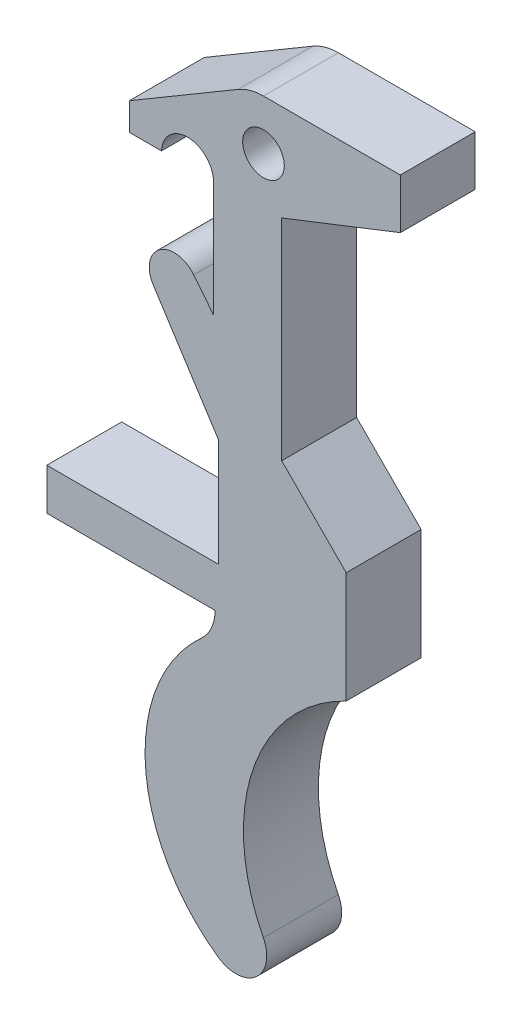
ISO-10303-21;
HEADER;
FILE_DESCRIPTION(('STEP AP214'),'2;1');
FILE_NAME('part.step','',(''),(''),'','','');
FILE_SCHEMA(('AUTOMOTIVE_DESIGN { 1 0 10303 214 1 1 1 1 }'));
ENDSEC;
DATA;
#1=APPLICATION_CONTEXT('core data for automotive mechanical design processes');
#2=APPLICATION_PROTOCOL_DEFINITION('international standard','automotive_design',2000,#1);
#3=PRODUCT_CONTEXT('',#1,'mechanical');
#4=PRODUCT('Part','Part','',(#3));
#5=PRODUCT_RELATED_PRODUCT_CATEGORY('part','',(#4));
#6=PRODUCT_DEFINITION_FORMATION('','',#4);
#7=PRODUCT_DEFINITION_CONTEXT('part definition',#1,'design');
#8=PRODUCT_DEFINITION('design','',#6,#7);
#9=PRODUCT_DEFINITION_SHAPE('','',#8);
#10=(LENGTH_UNIT() NAMED_UNIT(*) SI_UNIT(.MILLI.,.METRE.));
#11=(NAMED_UNIT(*) PLANE_ANGLE_UNIT() SI_UNIT($,.RADIAN.));
#12=(NAMED_UNIT(*) SI_UNIT($,.STERADIAN.) SOLID_ANGLE_UNIT());
#13=UNCERTAINTY_MEASURE_WITH_UNIT(LENGTH_MEASURE(1.E-05),#10,'distance_accuracy_value','');
#14=(GEOMETRIC_REPRESENTATION_CONTEXT(3) GLOBAL_UNCERTAINTY_ASSIGNED_CONTEXT((#13)) GLOBAL_UNIT_ASSIGNED_CONTEXT((#10,
#11,#12)) REPRESENTATION_CONTEXT('',''));
#15=CARTESIAN_POINT('',(0.,0.,0.));
#16=DIRECTION('',(0.,0.,1.));
#17=DIRECTION('',(1.,0.,0.));
#18=AXIS2_PLACEMENT_3D('',#15,#16,#17);
#19=CARTESIAN_POINT('',(2.19049760436048,0.,9.));
#20=DIRECTION('',(1.,0.,0.));
#21=DIRECTION('',(0.,1.,0.));
#22=AXIS2_PLACEMENT_3D('',#19,#20,#21);
#23=PLANE('',#22);
#24=DIRECTION('',(0.,-1.,0.));
#25=VECTOR('',#24,1.);
#26=CARTESIAN_POINT('',(2.19049760436048,0.,0.));
#27=LINE('',#26,#25);
#28=CARTESIAN_POINT('',(2.19049760436048,-5.58585000204006,0.));
#29=VERTEX_POINT('',#28);
#30=CARTESIAN_POINT('',(2.19049760436049,-30.8472529263684,0.));
#31=VERTEX_POINT('',#30);
#32=EDGE_CURVE('E221',#29,#31,#27,.T.);
#33=ORIENTED_EDGE('',*,*,#32,.F.);
#34=DIRECTION('',(0.,0.,-1.));
#35=VECTOR('',#34,1.);
#36=CARTESIAN_POINT('',(2.19049760436048,-5.58585000204006,9.));
#37=LINE('',#36,#35);
#38=CARTESIAN_POINT('',(2.19049760436048,-5.58585000204006,9.));
#39=VERTEX_POINT('',#38);
#40=EDGE_CURVE('E11',#39,#29,#37,.T.);
#41=ORIENTED_EDGE('',*,*,#40,.F.);
#42=DIRECTION('',(0.,-1.,0.));
#43=VECTOR('',#42,1.);
#44=CARTESIAN_POINT('',(2.19049760436048,0.,9.));
#45=LINE('',#44,#43);
#46=CARTESIAN_POINT('',(2.19049760436049,-30.8472529263684,9.));
#47=VERTEX_POINT('',#46);
#48=EDGE_CURVE('E284',#39,#47,#45,.T.);
#49=ORIENTED_EDGE('',*,*,#48,.T.);
#50=DIRECTION('',(0.,0.,-1.));
#51=VECTOR('',#50,1.);
#52=CARTESIAN_POINT('',(2.19049760436049,-30.8472529263684,9.));
#53=LINE('',#52,#51);
#54=EDGE_CURVE('E51',#47,#31,#53,.T.);
#55=ORIENTED_EDGE('',*,*,#54,.T.);
#56=EDGE_LOOP('',(#33,#41,#49,#55));
#57=FACE_BOUND('',#56,.T.);
#58=ADVANCED_FACE('F35',(#57),#23,.T.);
#59=CARTESIAN_POINT('',(2.19049760436048,-5.58585000204006,9.));
#60=DIRECTION('',(0.36508293406008,-0.930975000340011,0.));
#61=DIRECTION('',(0.930975000340011,0.36508293406008,0.));
#62=AXIS2_PLACEMENT_3D('',#59,#60,#61);
#63=PLANE('',#62);
#64=DIRECTION('',(-0.930975000340011,-0.365082934060081,0.));
#65=VECTOR('',#64,1.);
#66=CARTESIAN_POINT('',(2.19049760436048,-5.58585000204006,0.));
#67=LINE('',#66,#65);
#68=CARTESIAN_POINT('',(16.4346219454142,0.,0.));
#69=VERTEX_POINT('',#68);
#70=EDGE_CURVE('E223',#69,#29,#67,.T.);
#71=ORIENTED_EDGE('',*,*,#70,.F.);
#72=DIRECTION('',(0.,0.,-1.));
#73=VECTOR('',#72,1.);
#74=CARTESIAN_POINT('',(16.4346219454142,0.,9.));
#75=LINE('',#74,#73);
#76=CARTESIAN_POINT('',(16.4346219454142,0.,9.));
#77=VERTEX_POINT('',#76);
#78=EDGE_CURVE('E43',#77,#69,#75,.T.);
#79=ORIENTED_EDGE('',*,*,#78,.F.);
#80=DIRECTION('',(-0.930975000340011,-0.365082934060081,0.));
#81=VECTOR('',#80,1.);
#82=CARTESIAN_POINT('',(2.19049760436048,-5.58585000204006,9.));
#83=LINE('',#82,#81);
#84=EDGE_CURVE('E348',#77,#39,#83,.T.);
#85=ORIENTED_EDGE('',*,*,#84,.T.);
#86=ORIENTED_EDGE('',*,*,#40,.T.);
#87=EDGE_LOOP('',(#71,#79,#85,#86));
#88=FACE_BOUND('',#87,.T.);
#89=ADVANCED_FACE('F336',(#88),#63,.T.);
#90=CARTESIAN_POINT('',(16.4346219454142,0.,9.));
#91=DIRECTION('',(1.,0.,0.));
#92=DIRECTION('',(0.,0.,-1.));
#93=AXIS2_PLACEMENT_3D('',#90,#91,#92);
#94=PLANE('',#93);
#95=DIRECTION('',(0.,-1.,0.));
#96=VECTOR('',#95,1.);
#97=CARTESIAN_POINT('',(16.4346219454142,0.,0.));
#98=LINE('',#97,#96);
#99=CARTESIAN_POINT('',(16.4346219454142,6.,0.));
#100=VERTEX_POINT('',#99);
#101=EDGE_CURVE('E226',#100,#69,#98,.T.);
#102=ORIENTED_EDGE('',*,*,#101,.F.);
#103=DIRECTION('',(0.,0.,-1.));
#104=VECTOR('',#103,1.);
#105=CARTESIAN_POINT('',(16.4346219454142,6.,9.));
#106=LINE('',#105,#104);
#107=CARTESIAN_POINT('',(16.4346219454142,6.,9.));
#108=VERTEX_POINT('',#107);
#109=EDGE_CURVE('E325',#108,#100,#106,.T.);
#110=ORIENTED_EDGE('',*,*,#109,.F.);
#111=DIRECTION('',(0.,-1.,0.));
#112=VECTOR('',#111,1.);
#113=CARTESIAN_POINT('',(16.4346219454142,0.,9.));
#114=LINE('',#113,#112);
#115=EDGE_CURVE('E332',#108,#77,#114,.T.);
#116=ORIENTED_EDGE('',*,*,#115,.T.);
#117=ORIENTED_EDGE('',*,*,#78,.T.);
#118=EDGE_LOOP('',(#102,#110,#116,#117));
#119=FACE_BOUND('',#118,.T.);
#120=ADVANCED_FACE('F330',(#119),#94,.T.);
#121=CARTESIAN_POINT('',(0.,6.,9.));
#122=DIRECTION('',(0.,1.,0.));
#123=DIRECTION('',(0.,0.,1.));
#124=AXIS2_PLACEMENT_3D('',#121,#122,#123);
#125=PLANE('',#124);
#126=DIRECTION('',(1.,0.,0.));
#127=VECTOR('',#126,1.);
#128=CARTESIAN_POINT('',(0.,6.,0.));
#129=LINE('',#128,#127);
#130=CARTESIAN_POINT('',(0.,6.,0.));
#131=VERTEX_POINT('',#130);
#132=EDGE_CURVE('E229',#131,#100,#129,.T.);
#133=ORIENTED_EDGE('',*,*,#132,.F.);
#134=DIRECTION('',(0.,0.,-1.));
#135=VECTOR('',#134,1.);
#136=CARTESIAN_POINT('',(0.,6.,9.));
#137=LINE('',#136,#135);
#138=CARTESIAN_POINT('',(0.,6.,9.));
#139=VERTEX_POINT('',#138);
#140=EDGE_CURVE('E323',#139,#131,#137,.T.);
#141=ORIENTED_EDGE('',*,*,#140,.F.);
#142=DIRECTION('',(1.,0.,0.));
#143=VECTOR('',#142,1.);
#144=CARTESIAN_POINT('',(0.,6.,9.));
#145=LINE('',#144,#143);
#146=EDGE_CURVE('E347',#139,#108,#145,.T.);
#147=ORIENTED_EDGE('',*,*,#146,.T.);
#148=ORIENTED_EDGE('',*,*,#109,.T.);
#149=EDGE_LOOP('',(#133,#141,#147,#148));
#150=FACE_BOUND('',#149,.T.);
#151=ADVANCED_FACE('F343',(#150),#125,.T.);
#152=CARTESIAN_POINT('',(0.,0.,9.));
#153=DIRECTION('',(0.,0.,-1.));
#154=DIRECTION('',(-1.,0.,0.));
#155=AXIS2_PLACEMENT_3D('',#152,#153,#154);
#156=CYLINDRICAL_SURFACE('',#155,6.);
#157=CARTESIAN_POINT('',(0.,0.,0.));
#158=DIRECTION('',(0.,0.,1.));
#159=DIRECTION('',(1.,0.,0.));
#160=AXIS2_PLACEMENT_3D('',#157,#158,#159);
#161=CIRCLE('',#160,6.);
#162=CARTESIAN_POINT('',(-3.04957065323369,5.16721577166426,0.));
#163=VERTEX_POINT('',#162);
#164=EDGE_CURVE('E232',#131,#163,#161,.T.);
#165=ORIENTED_EDGE('',*,*,#164,.T.);
#166=DIRECTION('',(0.,0.,-1.));
#167=VECTOR('',#166,1.);
#168=CARTESIAN_POINT('',(-3.04957065323369,5.16721577166426,9.));
#169=LINE('',#168,#167);
#170=CARTESIAN_POINT('',(-3.04957065323369,5.16721577166426,9.));
#171=VERTEX_POINT('',#170);
#172=EDGE_CURVE('E321',#171,#163,#169,.T.);
#173=ORIENTED_EDGE('',*,*,#172,.F.);
#174=CARTESIAN_POINT('',(0.,0.,9.));
#175=DIRECTION('',(0.,0.,1.));
#176=DIRECTION('',(1.,0.,0.));
#177=AXIS2_PLACEMENT_3D('',#174,#175,#176);
#178=CIRCLE('',#177,6.);
#179=EDGE_CURVE('E350',#139,#171,#178,.T.);
#180=ORIENTED_EDGE('',*,*,#179,.F.);
#181=ORIENTED_EDGE('',*,*,#140,.T.);
#182=EDGE_LOOP('',(#165,#173,#180,#181));
#183=FACE_BOUND('',#182,.T.);
#184=ADVANCED_FACE('F423',(#183),#156,.T.);
#185=CARTESIAN_POINT('',(-3.04957065323369,5.16721577166426,9.));
#186=DIRECTION('',(-0.508261775538949,0.861202628610709,0.));
#187=DIRECTION('',(-0.861202628610709,-0.508261775538949,0.));
#188=AXIS2_PLACEMENT_3D('',#185,#186,#187);
#189=PLANE('',#188);
#190=DIRECTION('',(0.861202628610709,0.508261775538949,0.));
#191=VECTOR('',#190,1.);
#192=CARTESIAN_POINT('',(-3.04957065323369,5.16721577166426,0.));
#193=LINE('',#192,#191);
#194=CARTESIAN_POINT('',(-16.1110905908968,-2.54138972279823,0.));
#195=VERTEX_POINT('',#194);
#196=EDGE_CURVE('E235',#195,#163,#193,.T.);
#197=ORIENTED_EDGE('',*,*,#196,.F.);
#198=DIRECTION('',(0.,0.,-1.));
#199=VECTOR('',#198,1.);
#200=CARTESIAN_POINT('',(-16.1110905908968,-2.54138972279823,9.));
#201=LINE('',#200,#199);
#202=CARTESIAN_POINT('',(-16.1110905908968,-2.54138972279823,9.));
#203=VERTEX_POINT('',#202);
#204=EDGE_CURVE('E319',#203,#195,#201,.T.);
#205=ORIENTED_EDGE('',*,*,#204,.F.);
#206=DIRECTION('',(0.861202628610709,0.508261775538949,0.));
#207=VECTOR('',#206,1.);
#208=CARTESIAN_POINT('',(-3.04957065323369,5.16721577166426,9.));
#209=LINE('',#208,#207);
#210=EDGE_CURVE('E356',#203,#171,#209,.T.);
#211=ORIENTED_EDGE('',*,*,#210,.T.);
#212=ORIENTED_EDGE('',*,*,#172,.T.);
#213=EDGE_LOOP('',(#197,#205,#211,#212));
#214=FACE_BOUND('',#213,.T.);
#215=ADVANCED_FACE('F426',(#214),#189,.T.);
#216=CARTESIAN_POINT('',(-16.1110905908968,0.,9.));
#217=DIRECTION('',(1.,0.,0.));
#218=DIRECTION('',(0.,0.,-1.));
#219=AXIS2_PLACEMENT_3D('',#216,#217,#218);
#220=PLANE('',#219);
#221=DIRECTION('',(0.,-1.,0.));
#222=VECTOR('',#221,1.);
#223=CARTESIAN_POINT('',(-16.1110905908968,0.,0.));
#224=LINE('',#223,#222);
#225=CARTESIAN_POINT('',(-16.1110905908968,-5.83694375549647,0.));
#226=VERTEX_POINT('',#225);
#227=EDGE_CURVE('E238',#195,#226,#224,.T.);
#228=ORIENTED_EDGE('',*,*,#227,.T.);
#229=DIRECTION('',(0.,0.,-1.));
#230=VECTOR('',#229,1.);
#231=CARTESIAN_POINT('',(-16.1110905908968,-5.83694375549647,9.));
#232=LINE('',#231,#230);
#233=CARTESIAN_POINT('',(-16.1110905908968,-5.83694375549647,9.));
#234=VERTEX_POINT('',#233);
#235=EDGE_CURVE('E316',#234,#226,#232,.T.);
#236=ORIENTED_EDGE('',*,*,#235,.F.);
#237=DIRECTION('',(0.,-1.,0.));
#238=VECTOR('',#237,1.);
#239=CARTESIAN_POINT('',(-16.1110905908968,0.,9.));
#240=LINE('',#239,#238);
#241=EDGE_CURVE('E359',#203,#234,#240,.T.);
#242=ORIENTED_EDGE('',*,*,#241,.F.);
#243=ORIENTED_EDGE('',*,*,#204,.T.);
#244=EDGE_LOOP('',(#228,#236,#242,#243));
#245=FACE_BOUND('',#244,.T.);
#246=ADVANCED_FACE('F430',(#245),#220,.F.);
#247=CARTESIAN_POINT('',(0.,-5.83694375549647,9.));
#248=DIRECTION('',(0.,1.,0.));
#249=DIRECTION('',(0.,0.,1.));
#250=AXIS2_PLACEMENT_3D('',#247,#248,#249);
#251=PLANE('',#250);
#252=DIRECTION('',(1.,0.,0.));
#253=VECTOR('',#252,1.);
#254=CARTESIAN_POINT('',(0.,-5.83694375549647,0.));
#255=LINE('',#254,#253);
#256=CARTESIAN_POINT('',(-12.2502019339659,-5.83694375549647,0.));
#257=VERTEX_POINT('',#256);
#258=EDGE_CURVE('E240',#226,#257,#255,.T.);
#259=ORIENTED_EDGE('',*,*,#258,.T.);
#260=DIRECTION('',(0.,0.,-1.));
#261=VECTOR('',#260,1.);
#262=CARTESIAN_POINT('',(-12.2502019339659,-5.83694375549647,9.));
#263=LINE('',#262,#261);
#264=CARTESIAN_POINT('',(-12.2502019339659,-5.83694375549647,9.));
#265=VERTEX_POINT('',#264);
#266=EDGE_CURVE('E313',#265,#257,#263,.T.);
#267=ORIENTED_EDGE('',*,*,#266,.F.);
#268=DIRECTION('',(1.,0.,0.));
#269=VECTOR('',#268,1.);
#270=CARTESIAN_POINT('',(0.,-5.83694375549647,9.));
#271=LINE('',#270,#269);
#272=EDGE_CURVE('E361',#234,#265,#271,.T.);
#273=ORIENTED_EDGE('',*,*,#272,.F.);
#274=ORIENTED_EDGE('',*,*,#235,.T.);
#275=EDGE_LOOP('',(#259,#267,#273,#274));
#276=FACE_BOUND('',#275,.T.);
#277=ADVANCED_FACE('F434',(#276),#251,.F.);
#278=CARTESIAN_POINT('',(-9.12503835207111,-5.96346351433926,9.));
#279=DIRECTION('',(0.,0.,-1.));
#280=DIRECTION('',(-1.,0.,0.));
#281=AXIS2_PLACEMENT_3D('',#278,#279,#280);
#282=CYLINDRICAL_SURFACE('',#281,3.12772355923272);
#283=CARTESIAN_POINT('',(-9.12503835207111,-5.96346351433926,0.));
#284=DIRECTION('',(0.,0.,1.));
#285=DIRECTION('',(1.,0.,0.));
#286=AXIS2_PLACEMENT_3D('',#283,#284,#285);
#287=CIRCLE('',#286,3.12772355923272);
#288=CARTESIAN_POINT('',(-6.,-5.83388743219411,0.));
#289=VERTEX_POINT('',#288);
#290=EDGE_CURVE('E242',#257,#289,#287,.F.);
#291=ORIENTED_EDGE('',*,*,#290,.T.);
#292=DIRECTION('',(0.,0.,-1.));
#293=VECTOR('',#292,1.);
#294=CARTESIAN_POINT('',(-6.,-5.83388743219411,9.));
#295=LINE('',#294,#293);
#296=CARTESIAN_POINT('',(-6.,-5.83388743219411,9.));
#297=VERTEX_POINT('',#296);
#298=EDGE_CURVE('E310',#297,#289,#295,.T.);
#299=ORIENTED_EDGE('',*,*,#298,.F.);
#300=CARTESIAN_POINT('',(-9.12503835207111,-5.96346351433926,9.));
#301=DIRECTION('',(0.,0.,1.));
#302=DIRECTION('',(1.,0.,0.));
#303=AXIS2_PLACEMENT_3D('',#300,#301,#302);
#304=CIRCLE('',#303,3.12772355923272);
#305=EDGE_CURVE('E363',#265,#297,#304,.F.);
#306=ORIENTED_EDGE('',*,*,#305,.F.);
#307=ORIENTED_EDGE('',*,*,#266,.T.);
#308=EDGE_LOOP('',(#291,#299,#306,#307));
#309=FACE_BOUND('',#308,.T.);
#310=ADVANCED_FACE('F438',(#309),#282,.F.);
#311=CARTESIAN_POINT('',(-6.,0.,9.));
#312=DIRECTION('',(1.,0.,0.));
#313=DIRECTION('',(0.,1.,0.));
#314=AXIS2_PLACEMENT_3D('',#311,#312,#313);
#315=PLANE('',#314);
#316=DIRECTION('',(0.,-1.,0.));
#317=VECTOR('',#316,1.);
#318=CARTESIAN_POINT('',(-6.,0.,0.));
#319=LINE('',#318,#317);
#320=CARTESIAN_POINT('',(-6.,-19.7804431954682,0.));
#321=VERTEX_POINT('',#320);
#322=EDGE_CURVE('E244',#289,#321,#319,.T.);
#323=ORIENTED_EDGE('',*,*,#322,.T.);
#324=DIRECTION('',(0.,0.,-1.));
#325=VECTOR('',#324,1.);
#326=CARTESIAN_POINT('',(-6.,-19.7804431954682,9.));
#327=LINE('',#326,#325);
#328=CARTESIAN_POINT('',(-6.,-19.7804431954682,9.));
#329=VERTEX_POINT('',#328);
#330=EDGE_CURVE('E308',#329,#321,#327,.T.);
#331=ORIENTED_EDGE('',*,*,#330,.F.);
#332=DIRECTION('',(0.,-1.,0.));
#333=VECTOR('',#332,1.);
#334=CARTESIAN_POINT('',(-6.,0.,9.));
#335=LINE('',#334,#333);
#336=EDGE_CURVE('E365',#297,#329,#335,.T.);
#337=ORIENTED_EDGE('',*,*,#336,.F.);
#338=ORIENTED_EDGE('',*,*,#298,.T.);
#339=EDGE_LOOP('',(#323,#331,#337,#338));
#340=FACE_BOUND('',#339,.T.);
#341=ADVANCED_FACE('F442',(#340),#315,.F.);
#342=CARTESIAN_POINT('',(-13.3132765177036,-10.5631337180503,9.));
#343=DIRECTION('',(0.783373670537249,0.621551037573744,0.));
#344=DIRECTION('',(-0.621551037573744,0.783373670537249,0.));
#345=AXIS2_PLACEMENT_3D('',#342,#343,#344);
#346=PLANE('',#345);
#347=DIRECTION('',(0.621551037573744,-0.783373670537249,0.));
#348=VECTOR('',#347,1.);
#349=CARTESIAN_POINT('',(-13.3132765177036,-10.5631337180503,0.));
#350=LINE('',#349,#348);
#351=CARTESIAN_POINT('',(-8.37073840033277,-16.7924761094476,0.));
#352=VERTEX_POINT('',#351);
#353=EDGE_CURVE('E247',#352,#321,#350,.T.);
#354=ORIENTED_EDGE('',*,*,#353,.F.);
#355=DIRECTION('',(0.,0.,-1.));
#356=VECTOR('',#355,1.);
#357=CARTESIAN_POINT('',(-8.37073840033277,-16.7924761094476,9.));
#358=LINE('',#357,#356);
#359=CARTESIAN_POINT('',(-8.37073840033277,-16.7924761094476,9.));
#360=VERTEX_POINT('',#359);
#361=EDGE_CURVE('E306',#360,#352,#358,.T.);
#362=ORIENTED_EDGE('',*,*,#361,.F.);
#363=DIRECTION('',(0.621551037573744,-0.783373670537249,0.));
#364=VECTOR('',#363,1.);
#365=CARTESIAN_POINT('',(-13.3132765177036,-10.5631337180503,9.));
#366=LINE('',#365,#364);
#367=EDGE_CURVE('E367',#360,#329,#366,.T.);
#368=ORIENTED_EDGE('',*,*,#367,.T.);
#369=ORIENTED_EDGE('',*,*,#330,.T.);
#370=EDGE_LOOP('',(#354,#362,#368,#369));
#371=FACE_BOUND('',#370,.T.);
#372=ADVANCED_FACE('F446',(#371),#346,.T.);
#373=CARTESIAN_POINT('',(-10.7208594119445,-18.6571292221688,9.));
#374=DIRECTION('',(0.,0.,-1.));
#375=DIRECTION('',(-1.,0.,0.));
#376=AXIS2_PLACEMENT_3D('',#373,#374,#375);
#377=CYLINDRICAL_SURFACE('',#376,3.);
#378=CARTESIAN_POINT('',(-10.7208594119445,-18.6571292221688,0.));
#379=DIRECTION('',(0.,0.,1.));
#380=DIRECTION('',(1.,0.,0.));
#381=AXIS2_PLACEMENT_3D('',#378,#379,#380);
#382=CIRCLE('',#381,3.);
#383=CARTESIAN_POINT('',(-13.2441886551019,-20.2797226803792,0.));
#384=VERTEX_POINT('',#383);
#385=EDGE_CURVE('E250',#384,#352,#382,.F.);
#386=ORIENTED_EDGE('',*,*,#385,.F.);
#387=DIRECTION('',(0.,0.,-1.));
#388=VECTOR('',#387,1.);
#389=CARTESIAN_POINT('',(-13.2441886551019,-20.2797226803792,9.));
#390=LINE('',#389,#388);
#391=CARTESIAN_POINT('',(-13.2441886551019,-20.2797226803792,9.));
#392=VERTEX_POINT('',#391);
#393=EDGE_CURVE('E304',#392,#384,#390,.T.);
#394=ORIENTED_EDGE('',*,*,#393,.F.);
#395=CARTESIAN_POINT('',(-10.7208594119445,-18.6571292221688,9.));
#396=DIRECTION('',(0.,0.,1.));
#397=DIRECTION('',(1.,0.,0.));
#398=AXIS2_PLACEMENT_3D('',#395,#396,#397);
#399=CIRCLE('',#398,3.);
#400=EDGE_CURVE('E370',#392,#360,#399,.F.);
#401=ORIENTED_EDGE('',*,*,#400,.T.);
#402=ORIENTED_EDGE('',*,*,#361,.T.);
#403=EDGE_LOOP('',(#386,#394,#401,#402));
#404=FACE_BOUND('',#403,.T.);
#405=ADVANCED_FACE('F450',(#404),#377,.T.);
#406=CARTESIAN_POINT('',(-18.5955890336414,-11.9576473024187,9.));
#407=DIRECTION('',(-0.841109747719113,-0.540864486070116,0.));
#408=DIRECTION('',(0.540864486070116,-0.841109747719113,0.));
#409=AXIS2_PLACEMENT_3D('',#406,#407,#408);
#410=PLANE('',#409);
#411=DIRECTION('',(-0.540864486070116,0.841109747719113,0.));
#412=VECTOR('',#411,1.);
#413=CARTESIAN_POINT('',(-18.5955890336414,-11.9576473024187,0.));
#414=LINE('',#413,#412);
#415=CARTESIAN_POINT('',(-5.42122731744266,-32.4453745332943,0.));
#416=VERTEX_POINT('',#415);
#417=EDGE_CURVE('E253',#416,#384,#414,.T.);
#418=ORIENTED_EDGE('',*,*,#417,.F.);
#419=DIRECTION('',(0.,0.,-1.));
#420=VECTOR('',#419,1.);
#421=CARTESIAN_POINT('',(-5.42122731744266,-32.4453745332943,9.));
#422=LINE('',#421,#420);
#423=CARTESIAN_POINT('',(-5.42122731744266,-32.4453745332943,9.));
#424=VERTEX_POINT('',#423);
#425=EDGE_CURVE('E302',#424,#416,#422,.T.);
#426=ORIENTED_EDGE('',*,*,#425,.F.);
#427=DIRECTION('',(-0.540864486070116,0.841109747719113,0.));
#428=VECTOR('',#427,1.);
#429=CARTESIAN_POINT('',(-18.5955890336414,-11.9576473024187,9.));
#430=LINE('',#429,#428);
#431=EDGE_CURVE('E373',#424,#392,#430,.T.);
#432=ORIENTED_EDGE('',*,*,#431,.T.);
#433=ORIENTED_EDGE('',*,*,#393,.T.);
#434=EDGE_LOOP('',(#418,#426,#432,#433));
#435=FACE_BOUND('',#434,.T.);
#436=ADVANCED_FACE('F454',(#435),#410,.T.);
#437=CARTESIAN_POINT('',(-5.42122731744267,0.,9.));
#438=DIRECTION('',(1.,0.,0.));
#439=DIRECTION('',(0.,1.,0.));
#440=AXIS2_PLACEMENT_3D('',#437,#438,#439);
#441=PLANE('',#440);
#442=DIRECTION('',(0.,-1.,0.));
#443=VECTOR('',#442,1.);
#444=CARTESIAN_POINT('',(-5.42122731744267,0.,0.));
#445=LINE('',#444,#443);
#446=CARTESIAN_POINT('',(-5.42122731744266,-45.4203048358405,0.));
#447=VERTEX_POINT('',#446);
#448=EDGE_CURVE('E256',#416,#447,#445,.T.);
#449=ORIENTED_EDGE('',*,*,#448,.T.);
#450=DIRECTION('',(0.,0.,-1.));
#451=VECTOR('',#450,1.);
#452=CARTESIAN_POINT('',(-5.42122731744266,-45.4203048358405,9.));
#453=LINE('',#452,#451);
#454=CARTESIAN_POINT('',(-5.42122731744266,-45.4203048358405,9.));
#455=VERTEX_POINT('',#454);
#456=EDGE_CURVE('E300',#455,#447,#453,.T.);
#457=ORIENTED_EDGE('',*,*,#456,.F.);
#458=DIRECTION('',(0.,-1.,0.));
#459=VECTOR('',#458,1.);
#460=CARTESIAN_POINT('',(-5.42122731744267,0.,9.));
#461=LINE('',#460,#459);
#462=EDGE_CURVE('E376',#424,#455,#461,.T.);
#463=ORIENTED_EDGE('',*,*,#462,.F.);
#464=ORIENTED_EDGE('',*,*,#425,.T.);
#465=EDGE_LOOP('',(#449,#457,#463,#464));
#466=FACE_BOUND('',#465,.T.);
#467=ADVANCED_FACE('F458',(#466),#441,.F.);
#468=CARTESIAN_POINT('',(0.,-45.4203048358405,9.));
#469=DIRECTION('',(0.,1.,0.));
#470=DIRECTION('',(-1.,0.,0.));
#471=AXIS2_PLACEMENT_3D('',#468,#469,#470);
#472=PLANE('',#471);
#473=DIRECTION('',(1.,0.,0.));
#474=VECTOR('',#473,1.);
#475=CARTESIAN_POINT('',(0.,-45.4203048358405,0.));
#476=LINE('',#475,#474);
#477=CARTESIAN_POINT('',(-26.029458152636,-45.4203048358405,0.));
#478=VERTEX_POINT('',#477);
#479=EDGE_CURVE('E259',#478,#447,#476,.T.);
#480=ORIENTED_EDGE('',*,*,#479,.F.);
#481=DIRECTION('',(0.,0.,-1.));
#482=VECTOR('',#481,1.);
#483=CARTESIAN_POINT('',(-26.029458152636,-45.4203048358405,9.));
#484=LINE('',#483,#482);
#485=CARTESIAN_POINT('',(-26.029458152636,-45.4203048358405,9.));
#486=VERTEX_POINT('',#485);
#487=EDGE_CURVE('E298',#486,#478,#484,.T.);
#488=ORIENTED_EDGE('',*,*,#487,.F.);
#489=DIRECTION('',(1.,0.,0.));
#490=VECTOR('',#489,1.);
#491=CARTESIAN_POINT('',(0.,-45.4203048358405,9.));
#492=LINE('',#491,#490);
#493=EDGE_CURVE('E378',#486,#455,#492,.T.);
#494=ORIENTED_EDGE('',*,*,#493,.T.);
#495=ORIENTED_EDGE('',*,*,#456,.T.);
#496=EDGE_LOOP('',(#480,#488,#494,#495));
#497=FACE_BOUND('',#496,.T.);
#498=ADVANCED_FACE('F462',(#497),#472,.T.);
#499=CARTESIAN_POINT('',(-26.029458152636,0.,9.));
#500=DIRECTION('',(-1.,0.,0.));
#501=DIRECTION('',(0.,0.,1.));
#502=AXIS2_PLACEMENT_3D('',#499,#500,#501);
#503=PLANE('',#502);
#504=DIRECTION('',(0.,1.,0.));
#505=VECTOR('',#504,1.);
#506=CARTESIAN_POINT('',(-26.029458152636,0.,0.));
#507=LINE('',#506,#505);
#508=CARTESIAN_POINT('',(-26.029458152636,-50.4203048358405,0.));
#509=VERTEX_POINT('',#508);
#510=EDGE_CURVE('E262',#509,#478,#507,.T.);
#511=ORIENTED_EDGE('',*,*,#510,.F.);
#512=DIRECTION('',(0.,0.,-1.));
#513=VECTOR('',#512,1.);
#514=CARTESIAN_POINT('',(-26.029458152636,-50.4203048358405,9.));
#515=LINE('',#514,#513);
#516=CARTESIAN_POINT('',(-26.029458152636,-50.4203048358405,9.));
#517=VERTEX_POINT('',#516);
#518=EDGE_CURVE('E296',#517,#509,#515,.T.);
#519=ORIENTED_EDGE('',*,*,#518,.F.);
#520=DIRECTION('',(0.,1.,0.));
#521=VECTOR('',#520,1.);
#522=CARTESIAN_POINT('',(-26.029458152636,0.,9.));
#523=LINE('',#522,#521);
#524=EDGE_CURVE('E381',#517,#486,#523,.T.);
#525=ORIENTED_EDGE('',*,*,#524,.T.);
#526=ORIENTED_EDGE('',*,*,#487,.T.);
#527=EDGE_LOOP('',(#511,#519,#525,#526));
#528=FACE_BOUND('',#527,.T.);
#529=ADVANCED_FACE('F466',(#528),#503,.T.);
#530=CARTESIAN_POINT('',(0.,-50.4203048358405,9.));
#531=DIRECTION('',(0.,-1.,0.));
#532=DIRECTION('',(0.,0.,-1.));
#533=AXIS2_PLACEMENT_3D('',#530,#531,#532);
#534=PLANE('',#533);
#535=DIRECTION('',(-1.,0.,0.));
#536=VECTOR('',#535,1.);
#537=CARTESIAN_POINT('',(0.,-50.4203048358405,0.));
#538=LINE('',#537,#536);
#539=CARTESIAN_POINT('',(-5.81597817908101,-50.4203048358405,0.));
#540=VERTEX_POINT('',#539);
#541=EDGE_CURVE('E265',#540,#509,#538,.T.);
#542=ORIENTED_EDGE('',*,*,#541,.F.);
#543=DIRECTION('',(0.,0.,-1.));
#544=VECTOR('',#543,1.);
#545=CARTESIAN_POINT('',(-5.81597817908101,-50.4203048358405,9.));
#546=LINE('',#545,#544);
#547=CARTESIAN_POINT('',(-5.81597817908101,-50.4203048358405,9.));
#548=VERTEX_POINT('',#547);
#549=EDGE_CURVE('E294',#548,#540,#546,.T.);
#550=ORIENTED_EDGE('',*,*,#549,.F.);
#551=DIRECTION('',(-1.,0.,0.));
#552=VECTOR('',#551,1.);
#553=CARTESIAN_POINT('',(0.,-50.4203048358405,9.));
#554=LINE('',#553,#552);
#555=EDGE_CURVE('E384',#548,#517,#554,.T.);
#556=ORIENTED_EDGE('',*,*,#555,.T.);
#557=ORIENTED_EDGE('',*,*,#518,.T.);
#558=EDGE_LOOP('',(#542,#550,#556,#557));
#559=FACE_BOUND('',#558,.T.);
#560=ADVANCED_FACE('F470',(#559),#534,.T.);
#561=CARTESIAN_POINT('',(-10.815978179081,-50.4203048358405,9.));
#562=DIRECTION('',(0.,0.,-1.));
#563=DIRECTION('',(-1.,0.,0.));
#564=AXIS2_PLACEMENT_3D('',#561,#562,#563);
#565=CYLINDRICAL_SURFACE('',#564,5.);
#566=CARTESIAN_POINT('',(-10.815978179081,-50.4203048358405,0.));
#567=DIRECTION('',(0.,0.,1.));
#568=DIRECTION('',(1.,0.,0.));
#569=AXIS2_PLACEMENT_3D('',#566,#567,#568);
#570=CIRCLE('',#569,5.);
#571=CARTESIAN_POINT('',(-7.45624178295922,-54.1232997519286,0.));
#572=VERTEX_POINT('',#571);
#573=EDGE_CURVE('E268',#540,#572,#570,.F.);
#574=ORIENTED_EDGE('',*,*,#573,.T.);
#575=DIRECTION('',(0.,0.,-1.));
#576=VECTOR('',#575,1.);
#577=CARTESIAN_POINT('',(-7.45624178295922,-54.1232997519286,9.));
#578=LINE('',#577,#576);
#579=CARTESIAN_POINT('',(-7.45624178295922,-54.1232997519286,9.));
#580=VERTEX_POINT('',#579);
#581=EDGE_CURVE('E291',#580,#572,#578,.T.);
#582=ORIENTED_EDGE('',*,*,#581,.F.);
#583=CARTESIAN_POINT('',(-10.815978179081,-50.4203048358405,9.));
#584=DIRECTION('',(0.,0.,1.));
#585=DIRECTION('',(1.,0.,0.));
#586=AXIS2_PLACEMENT_3D('',#583,#584,#585);
#587=CIRCLE('',#586,5.);
#588=EDGE_CURVE('E387',#548,#580,#587,.F.);
#589=ORIENTED_EDGE('',*,*,#588,.F.);
#590=ORIENTED_EDGE('',*,*,#549,.T.);
#591=EDGE_LOOP('',(#574,#582,#589,#590));
#592=FACE_BOUND('',#591,.T.);
#593=ADVANCED_FACE('F474',(#592),#565,.F.);
#594=CARTESIAN_POINT('',(6.41160223813725,-69.4079976724263,9.));
#595=DIRECTION('',(0.,0.,-1.));
#596=DIRECTION('',(-1.,0.,0.));
#597=AXIS2_PLACEMENT_3D('',#594,#595,#596);
#598=CYLINDRICAL_SURFACE('',#597,20.6382917973927);
#599=CARTESIAN_POINT('',(6.41160223813725,-69.4079976724263,0.));
#600=DIRECTION('',(0.,0.,1.));
#601=DIRECTION('',(1.,0.,0.));
#602=AXIS2_PLACEMENT_3D('',#599,#600,#601);
#603=CIRCLE('',#602,20.6382917973927);
#604=CARTESIAN_POINT('',(-5.44277999843577,-86.3021596848953,0.));
#605=VERTEX_POINT('',#604);
#606=EDGE_CURVE('E270',#572,#605,#603,.T.);
#607=ORIENTED_EDGE('',*,*,#606,.T.);
#608=DIRECTION('',(0.,0.,-1.));
#609=VECTOR('',#608,1.);
#610=CARTESIAN_POINT('',(-5.44277999843577,-86.3021596848953,9.));
#611=LINE('',#610,#609);
#612=CARTESIAN_POINT('',(-5.44277999843577,-86.3021596848953,9.));
#613=VERTEX_POINT('',#612);
#614=EDGE_CURVE('E288',#613,#605,#611,.T.);
#615=ORIENTED_EDGE('',*,*,#614,.F.);
#616=CARTESIAN_POINT('',(6.41160223813725,-69.4079976724263,9.));
#617=DIRECTION('',(0.,0.,1.));
#618=DIRECTION('',(1.,0.,0.));
#619=AXIS2_PLACEMENT_3D('',#616,#617,#618);
#620=CIRCLE('',#619,20.6382917973927);
#621=EDGE_CURVE('E389',#580,#613,#620,.T.);
#622=ORIENTED_EDGE('',*,*,#621,.F.);
#623=ORIENTED_EDGE('',*,*,#581,.T.);
#624=EDGE_LOOP('',(#607,#615,#622,#623));
#625=FACE_BOUND('',#624,.T.);
#626=ADVANCED_FACE('F396',(#625),#598,.T.);
#627=CARTESIAN_POINT('',(-3.31361228098675,-83.2677962189251,9.));
#628=DIRECTION('',(0.,0.,-1.));
#629=DIRECTION('',(-1.,0.,0.));
#630=AXIS2_PLACEMENT_3D('',#627,#628,#629);
#631=CYLINDRICAL_SURFACE('',#630,3.70684728747239);
#632=CARTESIAN_POINT('',(-3.31361228098675,-83.2677962189251,0.));
#633=DIRECTION('',(0.,0.,1.));
#634=DIRECTION('',(1.,0.,0.));
#635=AXIS2_PLACEMENT_3D('',#632,#633,#634);
#636=CIRCLE('',#635,3.70684728747239);
#637=CARTESIAN_POINT('',(-0.0130727751656394,-81.5804445119134,0.));
#638=VERTEX_POINT('',#637);
#639=EDGE_CURVE('E272',#605,#638,#636,.T.);
#640=ORIENTED_EDGE('',*,*,#639,.T.);
#641=DIRECTION('',(0.,0.,-1.));
#642=VECTOR('',#641,1.);
#643=CARTESIAN_POINT('',(-0.0130727751656394,-81.5804445119134,9.));
#644=LINE('',#643,#642);
#645=CARTESIAN_POINT('',(-0.0130727751656394,-81.5804445119134,9.));
#646=VERTEX_POINT('',#645);
#647=EDGE_CURVE('E200',#646,#638,#644,.T.);
#648=ORIENTED_EDGE('',*,*,#647,.F.);
#649=CARTESIAN_POINT('',(-3.31361228098675,-83.2677962189251,9.));
#650=DIRECTION('',(0.,0.,1.));
#651=DIRECTION('',(1.,0.,0.));
#652=AXIS2_PLACEMENT_3D('',#649,#650,#651);
#653=CIRCLE('',#652,3.70684728747239);
#654=EDGE_CURVE('E209',#613,#646,#653,.T.);
#655=ORIENTED_EDGE('',*,*,#654,.F.);
#656=ORIENTED_EDGE('',*,*,#614,.T.);
#657=EDGE_LOOP('',(#640,#648,#655,#656));
#658=FACE_BOUND('',#657,.T.);
#659=ADVANCED_FACE('F400',(#658),#631,.T.);
#660=CARTESIAN_POINT('',(19.4293669294594,-71.6407865359333,9.));
#661=DIRECTION('',(0.,0.,-1.));
#662=DIRECTION('',(-1.,0.,0.));
#663=AXIS2_PLACEMENT_3D('',#660,#661,#662);
#664=CYLINDRICAL_SURFACE('',#663,21.8358710004305);
#665=CARTESIAN_POINT('',(19.4293669294594,-71.6407865359333,0.));
#666=DIRECTION('',(0.,0.,1.));
#667=DIRECTION('',(1.,0.,0.));
#668=AXIS2_PLACEMENT_3D('',#665,#666,#667);
#669=CIRCLE('',#668,21.8358710004305);
#670=CARTESIAN_POINT('',(9.93960745856214,-51.9748330240398,0.));
#671=VERTEX_POINT('',#670);
#672=EDGE_CURVE('E196',#671,#638,#669,.T.);
#673=ORIENTED_EDGE('',*,*,#672,.F.);
#674=DIRECTION('',(0.,0.,-1.));
#675=VECTOR('',#674,1.);
#676=CARTESIAN_POINT('',(9.93960745856214,-51.9748330240398,9.));
#677=LINE('',#676,#675);
#678=CARTESIAN_POINT('',(9.93960745856214,-51.9748330240398,9.));
#679=VERTEX_POINT('',#678);
#680=EDGE_CURVE('E191',#679,#671,#677,.T.);
#681=ORIENTED_EDGE('',*,*,#680,.F.);
#682=CARTESIAN_POINT('',(19.4293669294594,-71.6407865359333,9.));
#683=DIRECTION('',(0.,0.,1.));
#684=DIRECTION('',(1.,0.,0.));
#685=AXIS2_PLACEMENT_3D('',#682,#683,#684);
#686=CIRCLE('',#685,21.8358710004305);
#687=EDGE_CURVE('E194',#679,#646,#686,.T.);
#688=ORIENTED_EDGE('',*,*,#687,.T.);
#689=ORIENTED_EDGE('',*,*,#647,.T.);
#690=EDGE_LOOP('',(#673,#681,#688,#689));
#691=FACE_BOUND('',#690,.T.);
#692=ADVANCED_FACE('F193',(#691),#664,.F.);
#693=CARTESIAN_POINT('',(9.93960745856212,0.,9.));
#694=DIRECTION('',(1.,0.,0.));
#695=DIRECTION('',(0.,1.,0.));
#696=AXIS2_PLACEMENT_3D('',#693,#694,#695);
#697=PLANE('',#696);
#698=DIRECTION('',(0.,-1.,0.));
#699=VECTOR('',#698,1.);
#700=CARTESIAN_POINT('',(9.93960745856212,0.,0.));
#701=LINE('',#700,#699);
#702=CARTESIAN_POINT('',(9.93960745856213,-38.6224863512126,0.));
#703=VERTEX_POINT('',#702);
#704=EDGE_CURVE('E276',#703,#671,#701,.T.);
#705=ORIENTED_EDGE('',*,*,#704,.F.);
#706=DIRECTION('',(0.,0.,-1.));
#707=VECTOR('',#706,1.);
#708=CARTESIAN_POINT('',(9.93960745856213,-38.6224863512126,9.));
#709=LINE('',#708,#707);
#710=CARTESIAN_POINT('',(9.93960745856213,-38.6224863512126,9.));
#711=VERTEX_POINT('',#710);
#712=EDGE_CURVE('E121',#711,#703,#709,.T.);
#713=ORIENTED_EDGE('',*,*,#712,.F.);
#714=DIRECTION('',(0.,-1.,0.));
#715=VECTOR('',#714,1.);
#716=CARTESIAN_POINT('',(9.93960745856212,0.,9.));
#717=LINE('',#716,#715);
#718=EDGE_CURVE('E207',#711,#679,#717,.T.);
#719=ORIENTED_EDGE('',*,*,#718,.T.);
#720=ORIENTED_EDGE('',*,*,#680,.T.);
#721=EDGE_LOOP('',(#705,#713,#719,#720));
#722=FACE_BOUND('',#721,.T.);
#723=ADVANCED_FACE('F212',(#722),#697,.T.);
#724=CARTESIAN_POINT('',(-14.3246042659583,-14.2764758316051,9.));
#725=DIRECTION('',(0.708295661482504,0.705915898620411,0.));
#726=DIRECTION('',(-0.705915898620411,0.708295661482504,0.));
#727=AXIS2_PLACEMENT_3D('',#724,#725,#726);
#728=PLANE('',#727);
#729=DIRECTION('',(0.705915898620411,-0.708295661482504,0.));
#730=VECTOR('',#729,1.);
#731=CARTESIAN_POINT('',(-14.3246042659583,-14.2764758316051,0.));
#732=LINE('',#731,#730);
#733=EDGE_CURVE('E278',#31,#703,#732,.T.);
#734=ORIENTED_EDGE('',*,*,#733,.F.);
#735=ORIENTED_EDGE('',*,*,#54,.F.);
#736=DIRECTION('',(0.705915898620411,-0.708295661482504,0.));
#737=VECTOR('',#736,1.);
#738=CARTESIAN_POINT('',(-14.3246042659583,-14.2764758316051,9.));
#739=LINE('',#738,#737);
#740=EDGE_CURVE('E213',#47,#711,#739,.T.);
#741=ORIENTED_EDGE('',*,*,#740,.T.);
#742=ORIENTED_EDGE('',*,*,#712,.T.);
#743=EDGE_LOOP('',(#734,#735,#741,#742));
#744=FACE_BOUND('',#743,.T.);
#745=ADVANCED_FACE('F401',(#744),#728,.T.);
#746=CARTESIAN_POINT('',(0.,0.,9.));
#747=DIRECTION('',(0.,0.,-1.));
#748=DIRECTION('',(-1.,0.,0.));
#749=AXIS2_PLACEMENT_3D('',#746,#747,#748);
#750=CYLINDRICAL_SURFACE('',#749,2.5);
#751=CARTESIAN_POINT('',(0.,0.,9.));
#752=DIRECTION('',(0.,0.,1.));
#753=DIRECTION('',(1.,0.,0.));
#754=AXIS2_PLACEMENT_3D('',#751,#752,#753);
#755=CIRCLE('',#754,2.5);
#756=CARTESIAN_POINT('',(2.5,0.,9.));
#757=VERTEX_POINT('',#756);
#758=EDGE_CURVE('E215',#757,#757,#755,.T.);
#759=ORIENTED_EDGE('',*,*,#758,.T.);
#760=EDGE_LOOP('',(#759));
#761=FACE_BOUND('',#760,.T.);
#762=CARTESIAN_POINT('',(0.,0.,0.));
#763=DIRECTION('',(0.,0.,1.));
#764=DIRECTION('',(1.,0.,0.));
#765=AXIS2_PLACEMENT_3D('',#762,#763,#764);
#766=CIRCLE('',#765,2.5);
#767=CARTESIAN_POINT('',(2.5,0.,0.));
#768=VERTEX_POINT('',#767);
#769=EDGE_CURVE('E281',#768,#768,#766,.T.);
#770=ORIENTED_EDGE('',*,*,#769,.F.);
#771=EDGE_LOOP('',(#770));
#772=FACE_BOUND('',#771,.T.);
#773=ADVANCED_FACE('F403',(#761,#772),#750,.F.);
#774=CARTESIAN_POINT('',(0.,0.,9.));
#775=DIRECTION('',(0.,0.,1.));
#776=DIRECTION('',(1.,0.,0.));
#777=AXIS2_PLACEMENT_3D('',#774,#775,#776);
#778=PLANE('',#777);
#779=ORIENTED_EDGE('',*,*,#48,.F.);
#780=ORIENTED_EDGE('',*,*,#84,.F.);
#781=ORIENTED_EDGE('',*,*,#115,.F.);
#782=ORIENTED_EDGE('',*,*,#146,.F.);
#783=ORIENTED_EDGE('',*,*,#179,.T.);
#784=ORIENTED_EDGE('',*,*,#210,.F.);
#785=ORIENTED_EDGE('',*,*,#241,.T.);
#786=ORIENTED_EDGE('',*,*,#272,.T.);
#787=ORIENTED_EDGE('',*,*,#305,.T.);
#788=ORIENTED_EDGE('',*,*,#336,.T.);
#789=ORIENTED_EDGE('',*,*,#367,.F.);
#790=ORIENTED_EDGE('',*,*,#400,.F.);
#791=ORIENTED_EDGE('',*,*,#431,.F.);
#792=ORIENTED_EDGE('',*,*,#462,.T.);
#793=ORIENTED_EDGE('',*,*,#493,.F.);
#794=ORIENTED_EDGE('',*,*,#524,.F.);
#795=ORIENTED_EDGE('',*,*,#555,.F.);
#796=ORIENTED_EDGE('',*,*,#588,.T.);
#797=ORIENTED_EDGE('',*,*,#621,.T.);
#798=ORIENTED_EDGE('',*,*,#654,.T.);
#799=ORIENTED_EDGE('',*,*,#687,.F.);
#800=ORIENTED_EDGE('',*,*,#718,.F.);
#801=ORIENTED_EDGE('',*,*,#740,.F.);
#802=EDGE_LOOP('',(#779,#780,#781,#782,#783,#784,#785,#786,#787,#788,#789,#790,#791,#792,#793,
#794,#795,#796,#797,#798,#799,#800,#801));
#803=FACE_BOUND('',#802,.T.);
#804=ORIENTED_EDGE('',*,*,#758,.F.);
#805=EDGE_LOOP('',(#804));
#806=FACE_BOUND('',#805,.T.);
#807=ADVANCED_FACE('F204',(#803,#806),#778,.T.);
#808=CARTESIAN_POINT('',(0.,0.,0.));
#809=DIRECTION('',(0.,0.,1.));
#810=DIRECTION('',(1.,0.,0.));
#811=AXIS2_PLACEMENT_3D('',#808,#809,#810);
#812=PLANE('',#811);
#813=ORIENTED_EDGE('',*,*,#32,.T.);
#814=ORIENTED_EDGE('',*,*,#733,.T.);
#815=ORIENTED_EDGE('',*,*,#704,.T.);
#816=ORIENTED_EDGE('',*,*,#672,.T.);
#817=ORIENTED_EDGE('',*,*,#639,.F.);
#818=ORIENTED_EDGE('',*,*,#606,.F.);
#819=ORIENTED_EDGE('',*,*,#573,.F.);
#820=ORIENTED_EDGE('',*,*,#541,.T.);
#821=ORIENTED_EDGE('',*,*,#510,.T.);
#822=ORIENTED_EDGE('',*,*,#479,.T.);
#823=ORIENTED_EDGE('',*,*,#448,.F.);
#824=ORIENTED_EDGE('',*,*,#417,.T.);
#825=ORIENTED_EDGE('',*,*,#385,.T.);
#826=ORIENTED_EDGE('',*,*,#353,.T.);
#827=ORIENTED_EDGE('',*,*,#322,.F.);
#828=ORIENTED_EDGE('',*,*,#290,.F.);
#829=ORIENTED_EDGE('',*,*,#258,.F.);
#830=ORIENTED_EDGE('',*,*,#227,.F.);
#831=ORIENTED_EDGE('',*,*,#196,.T.);
#832=ORIENTED_EDGE('',*,*,#164,.F.);
#833=ORIENTED_EDGE('',*,*,#132,.T.);
#834=ORIENTED_EDGE('',*,*,#101,.T.);
#835=ORIENTED_EDGE('',*,*,#70,.T.);
#836=EDGE_LOOP('',(#813,#814,#815,#816,#817,#818,#819,#820,#821,#822,#823,#824,#825,#826,#827,
#828,#829,#830,#831,#832,#833,#834,#835));
#837=FACE_BOUND('',#836,.T.);
#838=ORIENTED_EDGE('',*,*,#769,.T.);
#839=EDGE_LOOP('',(#838));
#840=FACE_BOUND('',#839,.T.);
#841=ADVANCED_FACE('F338',(#837,#840),#812,.F.);
#842=CLOSED_SHELL('',(#58,#89,#120,#151,#184,#215,#246,#277,#310,#341,#372,#405,#436,#467,#498,
#529,#560,#593,#626,#659,#692,#723,#745,#773,#807,#841));
#843=MANIFOLD_SOLID_BREP('B2',#842);
#844=ADVANCED_BREP_SHAPE_REPRESENTATION('',(#18,#843),#14);
#845=SHAPE_DEFINITION_REPRESENTATION(#9,#844);
ENDSEC;
END-ISO-10303-21;
